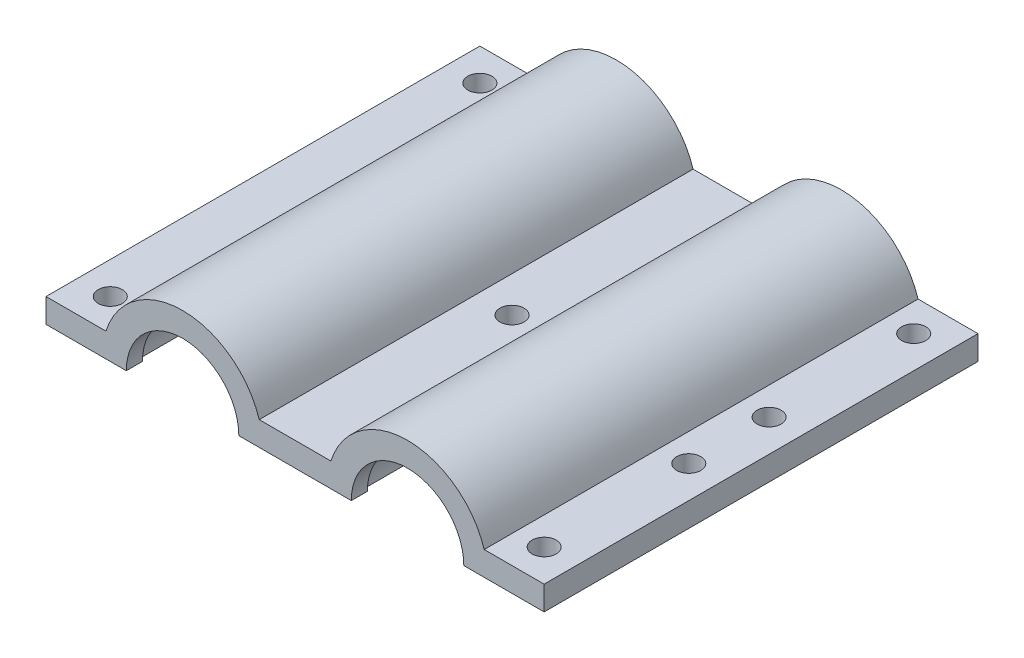
ISO-10303-21;
HEADER;
FILE_DESCRIPTION(('STEP AP214'),'2;1');
FILE_NAME('part.step','',(''),(''),'','','');
FILE_SCHEMA(('AUTOMOTIVE_DESIGN { 1 0 10303 214 1 1 1 1 }'));
ENDSEC;
DATA;
#1=APPLICATION_CONTEXT('core data for automotive mechanical design processes');
#2=APPLICATION_PROTOCOL_DEFINITION('international standard','automotive_design',2000,#1);
#3=PRODUCT_CONTEXT('',#1,'mechanical');
#4=PRODUCT('Part','Part','',(#3));
#5=PRODUCT_RELATED_PRODUCT_CATEGORY('part','',(#4));
#6=PRODUCT_DEFINITION_FORMATION('','',#4);
#7=PRODUCT_DEFINITION_CONTEXT('part definition',#1,'design');
#8=PRODUCT_DEFINITION('design','',#6,#7);
#9=PRODUCT_DEFINITION_SHAPE('','',#8);
#10=(LENGTH_UNIT() NAMED_UNIT(*) SI_UNIT(.MILLI.,.METRE.));
#11=(NAMED_UNIT(*) PLANE_ANGLE_UNIT() SI_UNIT($,.RADIAN.));
#12=(NAMED_UNIT(*) SI_UNIT($,.STERADIAN.) SOLID_ANGLE_UNIT());
#13=UNCERTAINTY_MEASURE_WITH_UNIT(LENGTH_MEASURE(1.E-05),#10,'distance_accuracy_value','');
#14=(GEOMETRIC_REPRESENTATION_CONTEXT(3) GLOBAL_UNCERTAINTY_ASSIGNED_CONTEXT((#13)) GLOBAL_UNIT_ASSIGNED_CONTEXT((#10,
#11,#12)) REPRESENTATION_CONTEXT('',''));
#15=CARTESIAN_POINT('',(0.,0.,0.));
#16=DIRECTION('',(0.,0.,1.));
#17=DIRECTION('',(1.,0.,0.));
#18=AXIS2_PLACEMENT_3D('',#15,#16,#17);
#19=CARTESIAN_POINT('',(14.,0.,27.));
#20=DIRECTION('',(0.,0.,-1.));
#21=DIRECTION('',(-1.,0.,0.));
#22=AXIS2_PLACEMENT_3D('',#19,#20,#21);
#23=CYLINDRICAL_SURFACE('',#22,7.5);
#24=CARTESIAN_POINT('',(14.,0.,-1.));
#25=DIRECTION('',(0.,0.,1.));
#26=DIRECTION('',(1.,0.,0.));
#27=AXIS2_PLACEMENT_3D('',#24,#25,#26);
#28=CIRCLE('',#27,7.5);
#29=CARTESIAN_POINT('',(6.5,0.,-1.));
#30=VERTEX_POINT('',#29);
#31=CARTESIAN_POINT('',(21.5,0.,-1.));
#32=VERTEX_POINT('',#31);
#33=EDGE_CURVE('E56',#30,#32,#28,.F.);
#34=ORIENTED_EDGE('',*,*,#33,.F.);
#35=DIRECTION('',(0.,0.,-1.));
#36=VECTOR('',#35,1.);
#37=CARTESIAN_POINT('',(6.5,0.,27.));
#38=LINE('',#37,#36);
#39=CARTESIAN_POINT('',(6.5,0.,-25.));
#40=VERTEX_POINT('',#39);
#41=EDGE_CURVE('E434',#30,#40,#38,.T.);
#42=ORIENTED_EDGE('',*,*,#41,.T.);
#43=CARTESIAN_POINT('',(14.,0.,-25.));
#44=DIRECTION('',(0.,0.,-1.));
#45=DIRECTION('',(-1.,0.,0.));
#46=AXIS2_PLACEMENT_3D('',#43,#44,#45);
#47=CIRCLE('',#46,7.5);
#48=CARTESIAN_POINT('',(21.5,0.,-25.));
#49=VERTEX_POINT('',#48);
#50=EDGE_CURVE('E304',#49,#40,#47,.F.);
#51=ORIENTED_EDGE('',*,*,#50,.F.);
#52=DIRECTION('',(0.,0.,-1.));
#53=VECTOR('',#52,1.);
#54=CARTESIAN_POINT('',(21.5,0.,27.));
#55=LINE('',#54,#53);
#56=EDGE_CURVE('E430',#32,#49,#55,.T.);
#57=ORIENTED_EDGE('',*,*,#56,.F.);
#58=EDGE_LOOP('',(#34,#42,#51,#57));
#59=FACE_BOUND('',#58,.T.);
#60=ADVANCED_FACE('F41',(#59),#23,.F.);
#61=CARTESIAN_POINT('',(-14.,0.,27.));
#62=DIRECTION('',(0.,0.,-1.));
#63=DIRECTION('',(-1.,0.,0.));
#64=AXIS2_PLACEMENT_3D('',#61,#62,#63);
#65=CYLINDRICAL_SURFACE('',#64,7.5);
#66=CARTESIAN_POINT('',(-14.,0.,-1.));
#67=DIRECTION('',(0.,0.,1.));
#68=DIRECTION('',(1.,0.,0.));
#69=AXIS2_PLACEMENT_3D('',#66,#67,#68);
#70=CIRCLE('',#69,7.5);
#71=CARTESIAN_POINT('',(-21.5,0.,-1.));
#72=VERTEX_POINT('',#71);
#73=CARTESIAN_POINT('',(-6.5,0.,-1.));
#74=VERTEX_POINT('',#73);
#75=EDGE_CURVE('E285',#72,#74,#70,.F.);
#76=ORIENTED_EDGE('',*,*,#75,.F.);
#77=DIRECTION('',(0.,0.,-1.));
#78=VECTOR('',#77,1.);
#79=CARTESIAN_POINT('',(-21.5,0.,27.));
#80=LINE('',#79,#78);
#81=CARTESIAN_POINT('',(-21.5,0.,-25.));
#82=VERTEX_POINT('',#81);
#83=EDGE_CURVE('E439',#72,#82,#80,.T.);
#84=ORIENTED_EDGE('',*,*,#83,.T.);
#85=CARTESIAN_POINT('',(-14.,0.,-25.));
#86=DIRECTION('',(0.,0.,-1.));
#87=DIRECTION('',(-1.,0.,0.));
#88=AXIS2_PLACEMENT_3D('',#85,#86,#87);
#89=CIRCLE('',#88,7.5);
#90=CARTESIAN_POINT('',(-6.5,0.,-25.));
#91=VERTEX_POINT('',#90);
#92=EDGE_CURVE('E324',#91,#82,#89,.F.);
#93=ORIENTED_EDGE('',*,*,#92,.F.);
#94=DIRECTION('',(0.,0.,-1.));
#95=VECTOR('',#94,1.);
#96=CARTESIAN_POINT('',(-6.5,0.,27.));
#97=LINE('',#96,#95);
#98=EDGE_CURVE('E436',#74,#91,#97,.T.);
#99=ORIENTED_EDGE('',*,*,#98,.F.);
#100=EDGE_LOOP('',(#76,#84,#93,#99));
#101=FACE_BOUND('',#100,.T.);
#102=ADVANCED_FACE('F447',(#101),#65,.F.);
#103=CARTESIAN_POINT('',(6.5,0.,25.));
#104=VERTEX_POINT('',#103);
#105=CARTESIAN_POINT('',(6.5,0.,1.));
#106=VERTEX_POINT('',#105);
#107=EDGE_CURVE('E64',#104,#106,#38,.T.);
#108=ORIENTED_EDGE('',*,*,#107,.T.);
#109=CARTESIAN_POINT('',(14.,0.,1.));
#110=DIRECTION('',(0.,0.,1.));
#111=DIRECTION('',(1.,0.,0.));
#112=AXIS2_PLACEMENT_3D('',#109,#110,#111);
#113=CIRCLE('',#112,7.5);
#114=CARTESIAN_POINT('',(21.5,0.,1.));
#115=VERTEX_POINT('',#114);
#116=EDGE_CURVE('E233',#106,#115,#113,.F.);
#117=ORIENTED_EDGE('',*,*,#116,.T.);
#118=CARTESIAN_POINT('',(21.5,0.,25.));
#119=VERTEX_POINT('',#118);
#120=EDGE_CURVE('E431',#119,#115,#55,.T.);
#121=ORIENTED_EDGE('',*,*,#120,.F.);
#122=CARTESIAN_POINT('',(14.,0.,25.));
#123=DIRECTION('',(0.,0.,1.));
#124=DIRECTION('',(1.,0.,0.));
#125=AXIS2_PLACEMENT_3D('',#122,#123,#124);
#126=CIRCLE('',#125,7.5);
#127=EDGE_CURVE('E344',#104,#119,#126,.F.);
#128=ORIENTED_EDGE('',*,*,#127,.F.);
#129=EDGE_LOOP('',(#108,#117,#121,#128));
#130=FACE_BOUND('',#129,.T.);
#131=ADVANCED_FACE('F483',(#130),#23,.F.);
#132=CARTESIAN_POINT('',(-21.5,0.,25.));
#133=VERTEX_POINT('',#132);
#134=CARTESIAN_POINT('',(-21.5,0.,1.));
#135=VERTEX_POINT('',#134);
#136=EDGE_CURVE('E49',#133,#135,#80,.T.);
#137=ORIENTED_EDGE('',*,*,#136,.T.);
#138=CARTESIAN_POINT('',(-14.,0.,1.));
#139=DIRECTION('',(0.,0.,1.));
#140=DIRECTION('',(1.,0.,0.));
#141=AXIS2_PLACEMENT_3D('',#138,#139,#140);
#142=CIRCLE('',#141,7.5);
#143=CARTESIAN_POINT('',(-6.5,0.,1.));
#144=VERTEX_POINT('',#143);
#145=EDGE_CURVE('E288',#135,#144,#142,.F.);
#146=ORIENTED_EDGE('',*,*,#145,.T.);
#147=CARTESIAN_POINT('',(-6.5,0.,25.));
#148=VERTEX_POINT('',#147);
#149=EDGE_CURVE('E437',#148,#144,#97,.T.);
#150=ORIENTED_EDGE('',*,*,#149,.F.);
#151=CARTESIAN_POINT('',(-14.,0.,25.));
#152=DIRECTION('',(0.,0.,1.));
#153=DIRECTION('',(1.,0.,0.));
#154=AXIS2_PLACEMENT_3D('',#151,#152,#153);
#155=CIRCLE('',#154,7.5);
#156=EDGE_CURVE('E363',#133,#148,#155,.F.);
#157=ORIENTED_EDGE('',*,*,#156,.F.);
#158=EDGE_LOOP('',(#137,#146,#150,#157));
#159=FACE_BOUND('',#158,.T.);
#160=ADVANCED_FACE('F481',(#159),#65,.F.);
#161=CARTESIAN_POINT('',(-31.,0.,27.));
#162=DIRECTION('',(1.,0.,0.));
#163=DIRECTION('',(0.,0.,-1.));
#164=AXIS2_PLACEMENT_3D('',#161,#162,#163);
#165=PLANE('',#164);
#166=DIRECTION('',(0.,-1.,0.));
#167=VECTOR('',#166,1.);
#168=CARTESIAN_POINT('',(-31.,0.,-27.));
#169=LINE('',#168,#167);
#170=CARTESIAN_POINT('',(-31.,3.,-27.));
#171=VERTEX_POINT('',#170);
#172=CARTESIAN_POINT('',(-31.,0.,-27.));
#173=VERTEX_POINT('',#172);
#174=EDGE_CURVE('E367',#171,#173,#169,.T.);
#175=ORIENTED_EDGE('',*,*,#174,.T.);
#176=DIRECTION('',(0.,0.,-1.));
#177=VECTOR('',#176,1.);
#178=CARTESIAN_POINT('',(-31.,0.,27.));
#179=LINE('',#178,#177);
#180=CARTESIAN_POINT('',(-31.,0.,27.));
#181=VERTEX_POINT('',#180);
#182=EDGE_CURVE('E11',#181,#173,#179,.T.);
#183=ORIENTED_EDGE('',*,*,#182,.F.);
#184=DIRECTION('',(0.,-1.,0.));
#185=VECTOR('',#184,1.);
#186=CARTESIAN_POINT('',(-31.,0.,27.));
#187=LINE('',#186,#185);
#188=CARTESIAN_POINT('',(-31.,3.,27.));
#189=VERTEX_POINT('',#188);
#190=EDGE_CURVE('E368',#189,#181,#187,.T.);
#191=ORIENTED_EDGE('',*,*,#190,.F.);
#192=DIRECTION('',(0.,0.,-1.));
#193=VECTOR('',#192,1.);
#194=CARTESIAN_POINT('',(-31.,3.,27.));
#195=LINE('',#194,#193);
#196=EDGE_CURVE('E390',#189,#171,#195,.T.);
#197=ORIENTED_EDGE('',*,*,#196,.T.);
#198=EDGE_LOOP('',(#175,#183,#191,#197));
#199=FACE_BOUND('',#198,.T.);
#200=ADVANCED_FACE('F43',(#199),#165,.F.);
#201=CARTESIAN_POINT('',(-31.,0.,27.));
#202=DIRECTION('',(0.,1.,0.));
#203=DIRECTION('',(0.,0.,1.));
#204=AXIS2_PLACEMENT_3D('',#201,#202,#203);
#205=PLANE('',#204);
#206=CARTESIAN_POINT('',(-27.,0.,23.));
#207=DIRECTION('',(0.,1.,0.));
#208=DIRECTION('',(0.,0.,1.));
#209=AXIS2_PLACEMENT_3D('',#206,#207,#208);
#210=CIRCLE('',#209,1.5);
#211=CARTESIAN_POINT('',(-27.,0.,24.5));
#212=VERTEX_POINT('',#211);
#213=EDGE_CURVE('E526',#212,#212,#210,.T.);
#214=ORIENTED_EDGE('',*,*,#213,.T.);
#215=EDGE_LOOP('',(#214));
#216=FACE_BOUND('',#215,.T.);
#217=CARTESIAN_POINT('',(-27.,0.,-23.));
#218=DIRECTION('',(0.,1.,0.));
#219=DIRECTION('',(0.,0.,1.));
#220=AXIS2_PLACEMENT_3D('',#217,#218,#219);
#221=CIRCLE('',#220,1.5);
#222=CARTESIAN_POINT('',(-27.,0.,-21.5));
#223=VERTEX_POINT('',#222);
#224=EDGE_CURVE('E256',#223,#223,#221,.T.);
#225=ORIENTED_EDGE('',*,*,#224,.T.);
#226=EDGE_LOOP('',(#225));
#227=FACE_BOUND('',#226,.T.);
#228=ORIENTED_EDGE('',*,*,#83,.F.);
#229=DIRECTION('',(1.,0.,0.));
#230=VECTOR('',#229,1.);
#231=CARTESIAN_POINT('',(-22.,0.,-1.));
#232=LINE('',#231,#230);
#233=CARTESIAN_POINT('',(-21.,0.,-1.));
#234=VERTEX_POINT('',#233);
#235=EDGE_CURVE('E268',#72,#234,#232,.T.);
#236=ORIENTED_EDGE('',*,*,#235,.T.);
#237=DIRECTION('',(0.,0.,-1.));
#238=VECTOR('',#237,1.);
#239=CARTESIAN_POINT('',(-21.,0.,1.));
#240=LINE('',#239,#238);
#241=CARTESIAN_POINT('',(-21.,0.,1.));
#242=VERTEX_POINT('',#241);
#243=EDGE_CURVE('E273',#242,#234,#240,.T.);
#244=ORIENTED_EDGE('',*,*,#243,.F.);
#245=DIRECTION('',(1.,0.,0.));
#246=VECTOR('',#245,1.);
#247=CARTESIAN_POINT('',(-22.,0.,1.));
#248=LINE('',#247,#246);
#249=EDGE_CURVE('E271',#135,#242,#248,.T.);
#250=ORIENTED_EDGE('',*,*,#249,.F.);
#251=ORIENTED_EDGE('',*,*,#136,.F.);
#252=DIRECTION('',(1.,0.,0.));
#253=VECTOR('',#252,1.);
#254=CARTESIAN_POINT('',(-22.,0.,25.));
#255=LINE('',#254,#253);
#256=CARTESIAN_POINT('',(-21.,0.,25.));
#257=VERTEX_POINT('',#256);
#258=EDGE_CURVE('E355',#133,#257,#255,.T.);
#259=ORIENTED_EDGE('',*,*,#258,.T.);
#260=DIRECTION('',(0.,0.,1.));
#261=VECTOR('',#260,1.);
#262=CARTESIAN_POINT('',(-21.,0.,25.));
#263=LINE('',#262,#261);
#264=CARTESIAN_POINT('',(-21.,0.,27.));
#265=VERTEX_POINT('',#264);
#266=EDGE_CURVE('E360',#257,#265,#263,.T.);
#267=ORIENTED_EDGE('',*,*,#266,.T.);
#268=DIRECTION('',(1.,0.,0.));
#269=VECTOR('',#268,1.);
#270=CARTESIAN_POINT('',(-31.,0.,27.));
#271=LINE('',#270,#269);
#272=EDGE_CURVE('E371',#181,#265,#271,.T.);
#273=ORIENTED_EDGE('',*,*,#272,.F.);
#274=ORIENTED_EDGE('',*,*,#182,.T.);
#275=DIRECTION('',(1.,0.,0.));
#276=VECTOR('',#275,1.);
#277=CARTESIAN_POINT('',(-31.,0.,-27.));
#278=LINE('',#277,#276);
#279=CARTESIAN_POINT('',(-21.,0.,-27.));
#280=VERTEX_POINT('',#279);
#281=EDGE_CURVE('E393',#173,#280,#278,.T.);
#282=ORIENTED_EDGE('',*,*,#281,.T.);
#283=DIRECTION('',(0.,0.,-1.));
#284=VECTOR('',#283,1.);
#285=CARTESIAN_POINT('',(-21.,0.,-25.));
#286=LINE('',#285,#284);
#287=CARTESIAN_POINT('',(-21.,0.,-25.));
#288=VERTEX_POINT('',#287);
#289=EDGE_CURVE('E318',#288,#280,#286,.T.);
#290=ORIENTED_EDGE('',*,*,#289,.F.);
#291=DIRECTION('',(1.,0.,0.));
#292=VECTOR('',#291,1.);
#293=CARTESIAN_POINT('',(-22.,0.,-25.));
#294=LINE('',#293,#292);
#295=EDGE_CURVE('E313',#82,#288,#294,.T.);
#296=ORIENTED_EDGE('',*,*,#295,.F.);
#297=EDGE_LOOP('',(#228,#236,#244,#250,#251,#259,#267,#273,#274,#282,#290,#296));
#298=FACE_BOUND('',#297,.T.);
#299=ADVANCED_FACE('F454',(#216,#227,#298),#205,.F.);
#300=CARTESIAN_POINT('',(-6.5,0.,27.));
#301=DIRECTION('',(0.,1.,0.));
#302=DIRECTION('',(0.,0.,1.));
#303=AXIS2_PLACEMENT_3D('',#300,#301,#302);
#304=PLANE('',#303);
#305=CARTESIAN_POINT('',(0.,0.,0.));
#306=DIRECTION('',(0.,1.,0.));
#307=DIRECTION('',(0.,0.,1.));
#308=AXIS2_PLACEMENT_3D('',#305,#306,#307);
#309=CIRCLE('',#308,1.5);
#310=CARTESIAN_POINT('',(0.,0.,1.5));
#311=VERTEX_POINT('',#310);
#312=EDGE_CURVE('E510',#311,#311,#309,.T.);
#313=ORIENTED_EDGE('',*,*,#312,.T.);
#314=EDGE_LOOP('',(#313));
#315=FACE_BOUND('',#314,.T.);
#316=ORIENTED_EDGE('',*,*,#41,.F.);
#317=DIRECTION('',(1.,0.,0.));
#318=VECTOR('',#317,1.);
#319=CARTESIAN_POINT('',(6.,0.,-1.));
#320=LINE('',#319,#318);
#321=CARTESIAN_POINT('',(7.,0.,-1.));
#322=VERTEX_POINT('',#321);
#323=EDGE_CURVE('E241',#30,#322,#320,.T.);
#324=ORIENTED_EDGE('',*,*,#323,.T.);
#325=DIRECTION('',(0.,0.,-1.));
#326=VECTOR('',#325,1.);
#327=CARTESIAN_POINT('',(7.,0.,1.));
#328=LINE('',#327,#326);
#329=CARTESIAN_POINT('',(7.,0.,1.));
#330=VERTEX_POINT('',#329);
#331=EDGE_CURVE('E238',#330,#322,#328,.T.);
#332=ORIENTED_EDGE('',*,*,#331,.F.);
#333=DIRECTION('',(1.,0.,0.));
#334=VECTOR('',#333,1.);
#335=CARTESIAN_POINT('',(6.,0.,1.));
#336=LINE('',#335,#334);
#337=EDGE_CURVE('E226',#106,#330,#336,.T.);
#338=ORIENTED_EDGE('',*,*,#337,.F.);
#339=ORIENTED_EDGE('',*,*,#107,.F.);
#340=DIRECTION('',(1.,0.,0.));
#341=VECTOR('',#340,1.);
#342=CARTESIAN_POINT('',(6.,0.,25.));
#343=LINE('',#342,#341);
#344=CARTESIAN_POINT('',(7.,0.,25.));
#345=VERTEX_POINT('',#344);
#346=EDGE_CURVE('E330',#104,#345,#343,.T.);
#347=ORIENTED_EDGE('',*,*,#346,.T.);
#348=DIRECTION('',(0.,0.,1.));
#349=VECTOR('',#348,1.);
#350=CARTESIAN_POINT('',(7.,0.,25.));
#351=LINE('',#350,#349);
#352=CARTESIAN_POINT('',(7.,0.,27.));
#353=VERTEX_POINT('',#352);
#354=EDGE_CURVE('E338',#345,#353,#351,.T.);
#355=ORIENTED_EDGE('',*,*,#354,.T.);
#356=DIRECTION('',(1.,0.,0.));
#357=VECTOR('',#356,1.);
#358=CARTESIAN_POINT('',(-6.5,0.,27.));
#359=LINE('',#358,#357);
#360=CARTESIAN_POINT('',(-7.,0.,27.));
#361=VERTEX_POINT('',#360);
#362=EDGE_CURVE('E374',#361,#353,#359,.T.);
#363=ORIENTED_EDGE('',*,*,#362,.F.);
#364=DIRECTION('',(0.,0.,1.));
#365=VECTOR('',#364,1.);
#366=CARTESIAN_POINT('',(-7.,0.,25.));
#367=LINE('',#366,#365);
#368=CARTESIAN_POINT('',(-7.,0.,25.));
#369=VERTEX_POINT('',#368);
#370=EDGE_CURVE('E357',#369,#361,#367,.T.);
#371=ORIENTED_EDGE('',*,*,#370,.F.);
#372=DIRECTION('',(1.,0.,0.));
#373=VECTOR('',#372,1.);
#374=CARTESIAN_POINT('',(-7.,0.,25.));
#375=LINE('',#374,#373);
#376=EDGE_CURVE('E352',#369,#148,#375,.T.);
#377=ORIENTED_EDGE('',*,*,#376,.T.);
#378=ORIENTED_EDGE('',*,*,#149,.T.);
#379=DIRECTION('',(1.,0.,0.));
#380=VECTOR('',#379,1.);
#381=CARTESIAN_POINT('',(-7.,0.,1.));
#382=LINE('',#381,#380);
#383=CARTESIAN_POINT('',(-7.,0.,1.));
#384=VERTEX_POINT('',#383);
#385=EDGE_CURVE('E267',#384,#144,#382,.T.);
#386=ORIENTED_EDGE('',*,*,#385,.F.);
#387=DIRECTION('',(0.,0.,-1.));
#388=VECTOR('',#387,1.);
#389=CARTESIAN_POINT('',(-7.,0.,1.));
#390=LINE('',#389,#388);
#391=CARTESIAN_POINT('',(-7.,0.,-1.));
#392=VERTEX_POINT('',#391);
#393=EDGE_CURVE('E282',#384,#392,#390,.T.);
#394=ORIENTED_EDGE('',*,*,#393,.T.);
#395=DIRECTION('',(1.,0.,0.));
#396=VECTOR('',#395,1.);
#397=CARTESIAN_POINT('',(-7.,0.,-1.));
#398=LINE('',#397,#396);
#399=EDGE_CURVE('E276',#392,#74,#398,.T.);
#400=ORIENTED_EDGE('',*,*,#399,.T.);
#401=ORIENTED_EDGE('',*,*,#98,.T.);
#402=DIRECTION('',(1.,0.,0.));
#403=VECTOR('',#402,1.);
#404=CARTESIAN_POINT('',(-7.,0.,-25.));
#405=LINE('',#404,#403);
#406=CARTESIAN_POINT('',(-7.,0.,-25.));
#407=VERTEX_POINT('',#406);
#408=EDGE_CURVE('E315',#407,#91,#405,.T.);
#409=ORIENTED_EDGE('',*,*,#408,.F.);
#410=DIRECTION('',(0.,0.,-1.));
#411=VECTOR('',#410,1.);
#412=CARTESIAN_POINT('',(-7.,0.,-25.));
#413=LINE('',#412,#411);
#414=CARTESIAN_POINT('',(-7.,0.,-27.));
#415=VERTEX_POINT('',#414);
#416=EDGE_CURVE('E321',#407,#415,#413,.T.);
#417=ORIENTED_EDGE('',*,*,#416,.T.);
#418=DIRECTION('',(1.,0.,0.));
#419=VECTOR('',#418,1.);
#420=CARTESIAN_POINT('',(-6.5,0.,-27.));
#421=LINE('',#420,#419);
#422=CARTESIAN_POINT('',(7.,0.,-27.));
#423=VERTEX_POINT('',#422);
#424=EDGE_CURVE('E395',#415,#423,#421,.T.);
#425=ORIENTED_EDGE('',*,*,#424,.T.);
#426=DIRECTION('',(0.,0.,-1.));
#427=VECTOR('',#426,1.);
#428=CARTESIAN_POINT('',(7.,0.,-25.));
#429=LINE('',#428,#427);
#430=CARTESIAN_POINT('',(7.,0.,-25.));
#431=VERTEX_POINT('',#430);
#432=EDGE_CURVE('E301',#431,#423,#429,.T.);
#433=ORIENTED_EDGE('',*,*,#432,.F.);
#434=DIRECTION('',(1.,0.,0.));
#435=VECTOR('',#434,1.);
#436=CARTESIAN_POINT('',(6.,0.,-25.));
#437=LINE('',#436,#435);
#438=EDGE_CURVE('E296',#40,#431,#437,.T.);
#439=ORIENTED_EDGE('',*,*,#438,.F.);
#440=EDGE_LOOP('',(#316,#324,#332,#338,#339,#347,#355,#363,#371,#377,#378,#386,#394,#400,#401,
#409,#417,#425,#433,#439));
#441=FACE_BOUND('',#440,.T.);
#442=ADVANCED_FACE('F239',(#315,#441),#304,.F.);
#443=CARTESIAN_POINT('',(21.5,0.,27.));
#444=DIRECTION('',(0.,1.,0.));
#445=DIRECTION('',(0.,0.,1.));
#446=AXIS2_PLACEMENT_3D('',#443,#444,#445);
#447=PLANE('',#446);
#448=CARTESIAN_POINT('',(27.,0.,5.));
#449=DIRECTION('',(0.,1.,0.));
#450=DIRECTION('',(0.,0.,1.));
#451=AXIS2_PLACEMENT_3D('',#448,#449,#450);
#452=CIRCLE('',#451,1.5);
#453=CARTESIAN_POINT('',(27.,0.,6.5));
#454=VERTEX_POINT('',#453);
#455=EDGE_CURVE('E945',#454,#454,#452,.T.);
#456=ORIENTED_EDGE('',*,*,#455,.T.);
#457=EDGE_LOOP('',(#456));
#458=FACE_BOUND('',#457,.T.);
#459=CARTESIAN_POINT('',(27.,0.,-5.));
#460=DIRECTION('',(0.,1.,0.));
#461=DIRECTION('',(0.,0.,1.));
#462=AXIS2_PLACEMENT_3D('',#459,#460,#461);
#463=CIRCLE('',#462,1.5);
#464=CARTESIAN_POINT('',(27.,0.,-3.5));
#465=VERTEX_POINT('',#464);
#466=EDGE_CURVE('E519',#465,#465,#463,.T.);
#467=ORIENTED_EDGE('',*,*,#466,.T.);
#468=EDGE_LOOP('',(#467));
#469=FACE_BOUND('',#468,.T.);
#470=CARTESIAN_POINT('',(27.,0.,23.));
#471=DIRECTION('',(0.,1.,0.));
#472=DIRECTION('',(0.,0.,1.));
#473=AXIS2_PLACEMENT_3D('',#470,#471,#472);
#474=CIRCLE('',#473,1.5);
#475=CARTESIAN_POINT('',(27.,0.,24.5));
#476=VERTEX_POINT('',#475);
#477=EDGE_CURVE('E534',#476,#476,#474,.T.);
#478=ORIENTED_EDGE('',*,*,#477,.T.);
#479=EDGE_LOOP('',(#478));
#480=FACE_BOUND('',#479,.T.);
#481=CARTESIAN_POINT('',(27.,0.,-23.));
#482=DIRECTION('',(0.,1.,0.));
#483=DIRECTION('',(0.,0.,1.));
#484=AXIS2_PLACEMENT_3D('',#481,#482,#483);
#485=CIRCLE('',#484,1.5);
#486=CARTESIAN_POINT('',(27.,0.,-21.5));
#487=VERTEX_POINT('',#486);
#488=EDGE_CURVE('E516',#487,#487,#485,.T.);
#489=ORIENTED_EDGE('',*,*,#488,.T.);
#490=EDGE_LOOP('',(#489));
#491=FACE_BOUND('',#490,.T.);
#492=ORIENTED_EDGE('',*,*,#120,.T.);
#493=DIRECTION('',(1.,0.,0.));
#494=VECTOR('',#493,1.);
#495=CARTESIAN_POINT('',(21.,0.,1.));
#496=LINE('',#495,#494);
#497=CARTESIAN_POINT('',(21.,0.,1.));
#498=VERTEX_POINT('',#497);
#499=EDGE_CURVE('E249',#498,#115,#496,.T.);
#500=ORIENTED_EDGE('',*,*,#499,.F.);
#501=DIRECTION('',(0.,0.,-1.));
#502=VECTOR('',#501,1.);
#503=CARTESIAN_POINT('',(21.,0.,1.));
#504=LINE('',#503,#502);
#505=CARTESIAN_POINT('',(21.,0.,-1.));
#506=VERTEX_POINT('',#505);
#507=EDGE_CURVE('E244',#498,#506,#504,.T.);
#508=ORIENTED_EDGE('',*,*,#507,.T.);
#509=DIRECTION('',(1.,0.,0.));
#510=VECTOR('',#509,1.);
#511=CARTESIAN_POINT('',(21.,0.,-1.));
#512=LINE('',#511,#510);
#513=EDGE_CURVE('E235',#506,#32,#512,.T.);
#514=ORIENTED_EDGE('',*,*,#513,.T.);
#515=ORIENTED_EDGE('',*,*,#56,.T.);
#516=DIRECTION('',(1.,0.,0.));
#517=VECTOR('',#516,1.);
#518=CARTESIAN_POINT('',(21.,0.,-25.));
#519=LINE('',#518,#517);
#520=CARTESIAN_POINT('',(21.,0.,-25.));
#521=VERTEX_POINT('',#520);
#522=EDGE_CURVE('E291',#521,#49,#519,.T.);
#523=ORIENTED_EDGE('',*,*,#522,.F.);
#524=DIRECTION('',(0.,0.,-1.));
#525=VECTOR('',#524,1.);
#526=CARTESIAN_POINT('',(21.,0.,-25.));
#527=LINE('',#526,#525);
#528=CARTESIAN_POINT('',(21.,0.,-27.));
#529=VERTEX_POINT('',#528);
#530=EDGE_CURVE('E298',#521,#529,#527,.T.);
#531=ORIENTED_EDGE('',*,*,#530,.T.);
#532=DIRECTION('',(1.,0.,0.));
#533=VECTOR('',#532,1.);
#534=CARTESIAN_POINT('',(21.5,0.,-27.));
#535=LINE('',#534,#533);
#536=CARTESIAN_POINT('',(31.,0.,-27.));
#537=VERTEX_POINT('',#536);
#538=EDGE_CURVE('E397',#529,#537,#535,.T.);
#539=ORIENTED_EDGE('',*,*,#538,.T.);
#540=DIRECTION('',(0.,0.,-1.));
#541=VECTOR('',#540,1.);
#542=CARTESIAN_POINT('',(31.,0.,27.));
#543=LINE('',#542,#541);
#544=CARTESIAN_POINT('',(31.,0.,27.));
#545=VERTEX_POINT('',#544);
#546=EDGE_CURVE('E427',#545,#537,#543,.T.);
#547=ORIENTED_EDGE('',*,*,#546,.F.);
#548=DIRECTION('',(1.,0.,0.));
#549=VECTOR('',#548,1.);
#550=CARTESIAN_POINT('',(21.5,0.,27.));
#551=LINE('',#550,#549);
#552=CARTESIAN_POINT('',(21.,0.,27.));
#553=VERTEX_POINT('',#552);
#554=EDGE_CURVE('E376',#553,#545,#551,.T.);
#555=ORIENTED_EDGE('',*,*,#554,.F.);
#556=DIRECTION('',(0.,0.,1.));
#557=VECTOR('',#556,1.);
#558=CARTESIAN_POINT('',(21.,0.,25.));
#559=LINE('',#558,#557);
#560=CARTESIAN_POINT('',(21.,0.,25.));
#561=VERTEX_POINT('',#560);
#562=EDGE_CURVE('E341',#561,#553,#559,.T.);
#563=ORIENTED_EDGE('',*,*,#562,.F.);
#564=DIRECTION('',(1.,0.,0.));
#565=VECTOR('',#564,1.);
#566=CARTESIAN_POINT('',(21.,0.,25.));
#567=LINE('',#566,#565);
#568=EDGE_CURVE('E335',#561,#119,#567,.T.);
#569=ORIENTED_EDGE('',*,*,#568,.T.);
#570=EDGE_LOOP('',(#492,#500,#508,#514,#515,#523,#531,#539,#547,#555,#563,#569));
#571=FACE_BOUND('',#570,.T.);
#572=ADVANCED_FACE('F497',(#458,#469,#480,#491,#571),#447,.F.);
#573=CARTESIAN_POINT('',(31.,0.,27.));
#574=DIRECTION('',(-1.,0.,0.));
#575=DIRECTION('',(0.,0.,1.));
#576=AXIS2_PLACEMENT_3D('',#573,#574,#575);
#577=PLANE('',#576);
#578=DIRECTION('',(0.,1.,0.));
#579=VECTOR('',#578,1.);
#580=CARTESIAN_POINT('',(31.,0.,-27.));
#581=LINE('',#580,#579);
#582=CARTESIAN_POINT('',(31.,3.,-27.));
#583=VERTEX_POINT('',#582);
#584=EDGE_CURVE('E399',#537,#583,#581,.T.);
#585=ORIENTED_EDGE('',*,*,#584,.T.);
#586=DIRECTION('',(0.,0.,-1.));
#587=VECTOR('',#586,1.);
#588=CARTESIAN_POINT('',(31.,3.,27.));
#589=LINE('',#588,#587);
#590=CARTESIAN_POINT('',(31.,3.,27.));
#591=VERTEX_POINT('',#590);
#592=EDGE_CURVE('E424',#591,#583,#589,.T.);
#593=ORIENTED_EDGE('',*,*,#592,.F.);
#594=DIRECTION('',(0.,1.,0.));
#595=VECTOR('',#594,1.);
#596=CARTESIAN_POINT('',(31.,0.,27.));
#597=LINE('',#596,#595);
#598=EDGE_CURVE('E378',#545,#591,#597,.T.);
#599=ORIENTED_EDGE('',*,*,#598,.F.);
#600=ORIENTED_EDGE('',*,*,#546,.T.);
#601=EDGE_LOOP('',(#585,#593,#599,#600));
#602=FACE_BOUND('',#601,.T.);
#603=ADVANCED_FACE('F505',(#602),#577,.F.);
#604=CARTESIAN_POINT('',(23.5393920141695,3.,27.));
#605=DIRECTION('',(0.,-1.,0.));
#606=DIRECTION('',(0.,0.,-1.));
#607=AXIS2_PLACEMENT_3D('',#604,#605,#606);
#608=PLANE('',#607);
#609=CARTESIAN_POINT('',(27.,3.,5.));
#610=DIRECTION('',(0.,1.,0.));
#611=DIRECTION('',(0.,0.,1.));
#612=AXIS2_PLACEMENT_3D('',#609,#610,#611);
#613=CIRCLE('',#612,1.5);
#614=CARTESIAN_POINT('',(27.,3.,6.5));
#615=VERTEX_POINT('',#614);
#616=EDGE_CURVE('E942',#615,#615,#613,.T.);
#617=ORIENTED_EDGE('',*,*,#616,.F.);
#618=EDGE_LOOP('',(#617));
#619=FACE_BOUND('',#618,.T.);
#620=CARTESIAN_POINT('',(27.,3.,-5.));
#621=DIRECTION('',(0.,1.,0.));
#622=DIRECTION('',(0.,0.,1.));
#623=AXIS2_PLACEMENT_3D('',#620,#621,#622);
#624=CIRCLE('',#623,1.5);
#625=CARTESIAN_POINT('',(27.,3.,-3.5));
#626=VERTEX_POINT('',#625);
#627=EDGE_CURVE('E946',#626,#626,#624,.T.);
#628=ORIENTED_EDGE('',*,*,#627,.F.);
#629=EDGE_LOOP('',(#628));
#630=FACE_BOUND('',#629,.T.);
#631=CARTESIAN_POINT('',(27.,3.,23.));
#632=DIRECTION('',(0.,1.,0.));
#633=DIRECTION('',(0.,0.,1.));
#634=AXIS2_PLACEMENT_3D('',#631,#632,#633);
#635=CIRCLE('',#634,1.5);
#636=CARTESIAN_POINT('',(27.,3.,24.5));
#637=VERTEX_POINT('',#636);
#638=EDGE_CURVE('E541',#637,#637,#635,.T.);
#639=ORIENTED_EDGE('',*,*,#638,.F.);
#640=EDGE_LOOP('',(#639));
#641=FACE_BOUND('',#640,.T.);
#642=CARTESIAN_POINT('',(27.,3.,-23.));
#643=DIRECTION('',(0.,1.,0.));
#644=DIRECTION('',(0.,0.,1.));
#645=AXIS2_PLACEMENT_3D('',#642,#643,#644);
#646=CIRCLE('',#645,1.5);
#647=CARTESIAN_POINT('',(27.,3.,-21.5));
#648=VERTEX_POINT('',#647);
#649=EDGE_CURVE('E512',#648,#648,#646,.T.);
#650=ORIENTED_EDGE('',*,*,#649,.F.);
#651=EDGE_LOOP('',(#650));
#652=FACE_BOUND('',#651,.T.);
#653=DIRECTION('',(-1.,0.,0.));
#654=VECTOR('',#653,1.);
#655=CARTESIAN_POINT('',(23.5393920141695,3.,-27.));
#656=LINE('',#655,#654);
#657=CARTESIAN_POINT('',(23.5393920141695,3.,-27.));
#658=VERTEX_POINT('',#657);
#659=EDGE_CURVE('E401',#583,#658,#656,.T.);
#660=ORIENTED_EDGE('',*,*,#659,.T.);
#661=DIRECTION('',(0.,0.,-1.));
#662=VECTOR('',#661,1.);
#663=CARTESIAN_POINT('',(23.5393920141695,3.,27.));
#664=LINE('',#663,#662);
#665=CARTESIAN_POINT('',(23.5393920141695,3.,27.));
#666=VERTEX_POINT('',#665);
#667=EDGE_CURVE('E421',#666,#658,#664,.T.);
#668=ORIENTED_EDGE('',*,*,#667,.F.);
#669=DIRECTION('',(-1.,0.,0.));
#670=VECTOR('',#669,1.);
#671=CARTESIAN_POINT('',(23.5393920141695,3.,27.));
#672=LINE('',#671,#670);
#673=EDGE_CURVE('E380',#591,#666,#672,.T.);
#674=ORIENTED_EDGE('',*,*,#673,.F.);
#675=ORIENTED_EDGE('',*,*,#592,.T.);
#676=EDGE_LOOP('',(#660,#668,#674,#675));
#677=FACE_BOUND('',#676,.T.);
#678=ADVANCED_FACE('F556',(#619,#630,#641,#652,#677),#608,.F.);
#679=CARTESIAN_POINT('',(14.,0.,27.));
#680=DIRECTION('',(0.,0.,-1.));
#681=DIRECTION('',(-1.,0.,0.));
#682=AXIS2_PLACEMENT_3D('',#679,#680,#681);
#683=CYLINDRICAL_SURFACE('',#682,10.);
#684=CARTESIAN_POINT('',(14.,0.,-27.));
#685=DIRECTION('',(0.,0.,1.));
#686=DIRECTION('',(1.,0.,0.));
#687=AXIS2_PLACEMENT_3D('',#684,#685,#686);
#688=CIRCLE('',#687,10.);
#689=CARTESIAN_POINT('',(4.46060798583054,3.,-27.));
#690=VERTEX_POINT('',#689);
#691=EDGE_CURVE('E403',#658,#690,#688,.T.);
#692=ORIENTED_EDGE('',*,*,#691,.T.);
#693=DIRECTION('',(0.,0.,-1.));
#694=VECTOR('',#693,1.);
#695=CARTESIAN_POINT('',(4.46060798583054,3.,27.));
#696=LINE('',#695,#694);
#697=CARTESIAN_POINT('',(4.46060798583054,3.,27.));
#698=VERTEX_POINT('',#697);
#699=EDGE_CURVE('E418',#698,#690,#696,.T.);
#700=ORIENTED_EDGE('',*,*,#699,.F.);
#701=CARTESIAN_POINT('',(14.,0.,27.));
#702=DIRECTION('',(0.,0.,1.));
#703=DIRECTION('',(1.,0.,0.));
#704=AXIS2_PLACEMENT_3D('',#701,#702,#703);
#705=CIRCLE('',#704,10.);
#706=EDGE_CURVE('E382',#666,#698,#705,.T.);
#707=ORIENTED_EDGE('',*,*,#706,.F.);
#708=ORIENTED_EDGE('',*,*,#667,.T.);
#709=EDGE_LOOP('',(#692,#700,#707,#708));
#710=FACE_BOUND('',#709,.T.);
#711=ADVANCED_FACE('F559',(#710),#683,.T.);
#712=CARTESIAN_POINT('',(-4.46060798583054,3.,27.));
#713=DIRECTION('',(0.,-1.,0.));
#714=DIRECTION('',(0.,0.,-1.));
#715=AXIS2_PLACEMENT_3D('',#712,#713,#714);
#716=PLANE('',#715);
#717=CARTESIAN_POINT('',(0.,3.,0.));
#718=DIRECTION('',(0.,1.,0.));
#719=DIRECTION('',(0.,0.,1.));
#720=AXIS2_PLACEMENT_3D('',#717,#718,#719);
#721=CIRCLE('',#720,1.5);
#722=CARTESIAN_POINT('',(0.,3.,1.5));
#723=VERTEX_POINT('',#722);
#724=EDGE_CURVE('E513',#723,#723,#721,.T.);
#725=ORIENTED_EDGE('',*,*,#724,.F.);
#726=EDGE_LOOP('',(#725));
#727=FACE_BOUND('',#726,.T.);
#728=DIRECTION('',(-1.,0.,0.));
#729=VECTOR('',#728,1.);
#730=CARTESIAN_POINT('',(-4.46060798583054,3.,-27.));
#731=LINE('',#730,#729);
#732=CARTESIAN_POINT('',(-4.46060798583054,3.,-27.));
#733=VERTEX_POINT('',#732);
#734=EDGE_CURVE('E405',#690,#733,#731,.T.);
#735=ORIENTED_EDGE('',*,*,#734,.T.);
#736=DIRECTION('',(0.,0.,-1.));
#737=VECTOR('',#736,1.);
#738=CARTESIAN_POINT('',(-4.46060798583054,3.,27.));
#739=LINE('',#738,#737);
#740=CARTESIAN_POINT('',(-4.46060798583054,3.,27.));
#741=VERTEX_POINT('',#740);
#742=EDGE_CURVE('E415',#741,#733,#739,.T.);
#743=ORIENTED_EDGE('',*,*,#742,.F.);
#744=DIRECTION('',(-1.,0.,0.));
#745=VECTOR('',#744,1.);
#746=CARTESIAN_POINT('',(-4.46060798583054,3.,27.));
#747=LINE('',#746,#745);
#748=EDGE_CURVE('E384',#698,#741,#747,.T.);
#749=ORIENTED_EDGE('',*,*,#748,.F.);
#750=ORIENTED_EDGE('',*,*,#699,.T.);
#751=EDGE_LOOP('',(#735,#743,#749,#750));
#752=FACE_BOUND('',#751,.T.);
#753=ADVANCED_FACE('F579',(#727,#752),#716,.F.);
#754=CARTESIAN_POINT('',(-14.,0.,27.));
#755=DIRECTION('',(0.,0.,-1.));
#756=DIRECTION('',(-1.,0.,0.));
#757=AXIS2_PLACEMENT_3D('',#754,#755,#756);
#758=CYLINDRICAL_SURFACE('',#757,10.);
#759=CARTESIAN_POINT('',(-14.,0.,-27.));
#760=DIRECTION('',(0.,0.,1.));
#761=DIRECTION('',(1.,0.,0.));
#762=AXIS2_PLACEMENT_3D('',#759,#760,#761);
#763=CIRCLE('',#762,10.);
#764=CARTESIAN_POINT('',(-23.5393920141695,3.,-27.));
#765=VERTEX_POINT('',#764);
#766=EDGE_CURVE('E407',#733,#765,#763,.T.);
#767=ORIENTED_EDGE('',*,*,#766,.T.);
#768=DIRECTION('',(0.,0.,-1.));
#769=VECTOR('',#768,1.);
#770=CARTESIAN_POINT('',(-23.5393920141695,3.,27.));
#771=LINE('',#770,#769);
#772=CARTESIAN_POINT('',(-23.5393920141695,3.,27.));
#773=VERTEX_POINT('',#772);
#774=EDGE_CURVE('E412',#773,#765,#771,.T.);
#775=ORIENTED_EDGE('',*,*,#774,.F.);
#776=CARTESIAN_POINT('',(-14.,0.,27.));
#777=DIRECTION('',(0.,0.,1.));
#778=DIRECTION('',(1.,0.,0.));
#779=AXIS2_PLACEMENT_3D('',#776,#777,#778);
#780=CIRCLE('',#779,10.);
#781=EDGE_CURVE('E386',#741,#773,#780,.T.);
#782=ORIENTED_EDGE('',*,*,#781,.F.);
#783=ORIENTED_EDGE('',*,*,#742,.T.);
#784=EDGE_LOOP('',(#767,#775,#782,#783));
#785=FACE_BOUND('',#784,.T.);
#786=ADVANCED_FACE('F583',(#785),#758,.T.);
#787=CARTESIAN_POINT('',(-31.,3.,27.));
#788=DIRECTION('',(0.,-1.,0.));
#789=DIRECTION('',(0.,0.,-1.));
#790=AXIS2_PLACEMENT_3D('',#787,#788,#789);
#791=PLANE('',#790);
#792=CARTESIAN_POINT('',(-27.,3.,23.));
#793=DIRECTION('',(0.,1.,0.));
#794=DIRECTION('',(0.,0.,1.));
#795=AXIS2_PLACEMENT_3D('',#792,#793,#794);
#796=CIRCLE('',#795,1.5);
#797=CARTESIAN_POINT('',(-27.,3.,24.5));
#798=VERTEX_POINT('',#797);
#799=EDGE_CURVE('E530',#798,#798,#796,.T.);
#800=ORIENTED_EDGE('',*,*,#799,.F.);
#801=EDGE_LOOP('',(#800));
#802=FACE_BOUND('',#801,.T.);
#803=CARTESIAN_POINT('',(-27.,3.,-23.));
#804=DIRECTION('',(0.,1.,0.));
#805=DIRECTION('',(0.,0.,1.));
#806=AXIS2_PLACEMENT_3D('',#803,#804,#805);
#807=CIRCLE('',#806,1.5);
#808=CARTESIAN_POINT('',(-27.,3.,-21.5));
#809=VERTEX_POINT('',#808);
#810=EDGE_CURVE('E524',#809,#809,#807,.T.);
#811=ORIENTED_EDGE('',*,*,#810,.F.);
#812=EDGE_LOOP('',(#811));
#813=FACE_BOUND('',#812,.T.);
#814=DIRECTION('',(-1.,0.,0.));
#815=VECTOR('',#814,1.);
#816=CARTESIAN_POINT('',(-31.,3.,-27.));
#817=LINE('',#816,#815);
#818=EDGE_CURVE('E372',#765,#171,#817,.T.);
#819=ORIENTED_EDGE('',*,*,#818,.T.);
#820=ORIENTED_EDGE('',*,*,#196,.F.);
#821=DIRECTION('',(-1.,0.,0.));
#822=VECTOR('',#821,1.);
#823=CARTESIAN_POINT('',(-31.,3.,27.));
#824=LINE('',#823,#822);
#825=EDGE_CURVE('E388',#773,#189,#824,.T.);
#826=ORIENTED_EDGE('',*,*,#825,.F.);
#827=ORIENTED_EDGE('',*,*,#774,.T.);
#828=EDGE_LOOP('',(#819,#820,#826,#827));
#829=FACE_BOUND('',#828,.T.);
#830=ADVANCED_FACE('F628',(#802,#813,#829),#791,.F.);
#831=CARTESIAN_POINT('',(-14.,0.,27.));
#832=DIRECTION('',(0.,0.,1.));
#833=DIRECTION('',(1.,0.,0.));
#834=AXIS2_PLACEMENT_3D('',#831,#832,#833);
#835=PLANE('',#834);
#836=ORIENTED_EDGE('',*,*,#362,.T.);
#837=CARTESIAN_POINT('',(14.,0.,27.));
#838=DIRECTION('',(0.,0.,-1.));
#839=DIRECTION('',(1.,0.,0.));
#840=AXIS2_PLACEMENT_3D('',#837,#838,#839);
#841=CIRCLE('',#840,7.);
#842=EDGE_CURVE('E329',#353,#553,#841,.T.);
#843=ORIENTED_EDGE('',*,*,#842,.T.);
#844=ORIENTED_EDGE('',*,*,#554,.T.);
#845=ORIENTED_EDGE('',*,*,#598,.T.);
#846=ORIENTED_EDGE('',*,*,#673,.T.);
#847=ORIENTED_EDGE('',*,*,#706,.T.);
#848=ORIENTED_EDGE('',*,*,#748,.T.);
#849=ORIENTED_EDGE('',*,*,#781,.T.);
#850=ORIENTED_EDGE('',*,*,#825,.T.);
#851=ORIENTED_EDGE('',*,*,#190,.T.);
#852=ORIENTED_EDGE('',*,*,#272,.T.);
#853=CARTESIAN_POINT('',(-14.,0.,27.));
#854=DIRECTION('',(0.,0.,-1.));
#855=DIRECTION('',(1.,0.,0.));
#856=AXIS2_PLACEMENT_3D('',#853,#854,#855);
#857=CIRCLE('',#856,7.);
#858=EDGE_CURVE('E348',#265,#361,#857,.T.);
#859=ORIENTED_EDGE('',*,*,#858,.T.);
#860=EDGE_LOOP('',(#836,#843,#844,#845,#846,#847,#848,#849,#850,#851,#852,#859));
#861=FACE_BOUND('',#860,.T.);
#862=ADVANCED_FACE('F587',(#861),#835,.T.);
#863=CARTESIAN_POINT('',(-14.,0.,-27.));
#864=DIRECTION('',(0.,0.,1.));
#865=DIRECTION('',(1.,0.,0.));
#866=AXIS2_PLACEMENT_3D('',#863,#864,#865);
#867=PLANE('',#866);
#868=CARTESIAN_POINT('',(14.,0.,-27.));
#869=DIRECTION('',(0.,0.,-1.));
#870=DIRECTION('',(1.,0.,0.));
#871=AXIS2_PLACEMENT_3D('',#868,#869,#870);
#872=CIRCLE('',#871,7.);
#873=EDGE_CURVE('E290',#423,#529,#872,.T.);
#874=ORIENTED_EDGE('',*,*,#873,.F.);
#875=ORIENTED_EDGE('',*,*,#424,.F.);
#876=CARTESIAN_POINT('',(-14.,0.,-27.));
#877=DIRECTION('',(0.,0.,-1.));
#878=DIRECTION('',(1.,0.,0.));
#879=AXIS2_PLACEMENT_3D('',#876,#877,#878);
#880=CIRCLE('',#879,7.);
#881=EDGE_CURVE('E309',#280,#415,#880,.T.);
#882=ORIENTED_EDGE('',*,*,#881,.F.);
#883=ORIENTED_EDGE('',*,*,#281,.F.);
#884=ORIENTED_EDGE('',*,*,#174,.F.);
#885=ORIENTED_EDGE('',*,*,#818,.F.);
#886=ORIENTED_EDGE('',*,*,#766,.F.);
#887=ORIENTED_EDGE('',*,*,#734,.F.);
#888=ORIENTED_EDGE('',*,*,#691,.F.);
#889=ORIENTED_EDGE('',*,*,#659,.F.);
#890=ORIENTED_EDGE('',*,*,#584,.F.);
#891=ORIENTED_EDGE('',*,*,#538,.F.);
#892=EDGE_LOOP('',(#874,#875,#882,#883,#884,#885,#886,#887,#888,#889,#890,#891));
#893=FACE_BOUND('',#892,.T.);
#894=ADVANCED_FACE('F574',(#893),#867,.F.);
#895=CARTESIAN_POINT('',(-14.,0.,25.));
#896=DIRECTION('',(0.,0.,1.));
#897=DIRECTION('',(1.,0.,0.));
#898=AXIS2_PLACEMENT_3D('',#895,#896,#897);
#899=PLANE('',#898);
#900=ORIENTED_EDGE('',*,*,#258,.F.);
#901=ORIENTED_EDGE('',*,*,#156,.T.);
#902=ORIENTED_EDGE('',*,*,#376,.F.);
#903=CARTESIAN_POINT('',(-14.,0.,25.));
#904=DIRECTION('',(0.,0.,-1.));
#905=DIRECTION('',(1.,0.,0.));
#906=AXIS2_PLACEMENT_3D('',#903,#904,#905);
#907=CIRCLE('',#906,7.);
#908=EDGE_CURVE('E349',#257,#369,#907,.T.);
#909=ORIENTED_EDGE('',*,*,#908,.F.);
#910=EDGE_LOOP('',(#900,#901,#902,#909));
#911=FACE_BOUND('',#910,.T.);
#912=ADVANCED_FACE('F479',(#911),#899,.F.);
#913=CARTESIAN_POINT('',(-14.,0.,25.));
#914=DIRECTION('',(0.,0.,1.));
#915=DIRECTION('',(1.,0.,0.));
#916=AXIS2_PLACEMENT_3D('',#913,#914,#915);
#917=CYLINDRICAL_SURFACE('',#916,7.);
#918=ORIENTED_EDGE('',*,*,#858,.F.);
#919=ORIENTED_EDGE('',*,*,#266,.F.);
#920=ORIENTED_EDGE('',*,*,#908,.T.);
#921=ORIENTED_EDGE('',*,*,#370,.T.);
#922=EDGE_LOOP('',(#918,#919,#920,#921));
#923=FACE_BOUND('',#922,.T.);
#924=ADVANCED_FACE('F477',(#923),#917,.F.);
#925=CARTESIAN_POINT('',(14.,0.,25.));
#926=DIRECTION('',(0.,0.,1.));
#927=DIRECTION('',(1.,0.,0.));
#928=AXIS2_PLACEMENT_3D('',#925,#926,#927);
#929=PLANE('',#928);
#930=ORIENTED_EDGE('',*,*,#346,.F.);
#931=ORIENTED_EDGE('',*,*,#127,.T.);
#932=ORIENTED_EDGE('',*,*,#568,.F.);
#933=CARTESIAN_POINT('',(14.,0.,25.));
#934=DIRECTION('',(0.,0.,-1.));
#935=DIRECTION('',(1.,0.,0.));
#936=AXIS2_PLACEMENT_3D('',#933,#934,#935);
#937=CIRCLE('',#936,7.);
#938=EDGE_CURVE('E332',#345,#561,#937,.T.);
#939=ORIENTED_EDGE('',*,*,#938,.F.);
#940=EDGE_LOOP('',(#930,#931,#932,#939));
#941=FACE_BOUND('',#940,.T.);
#942=ADVANCED_FACE('F612',(#941),#929,.F.);
#943=CARTESIAN_POINT('',(14.,0.,25.));
#944=DIRECTION('',(0.,0.,1.));
#945=DIRECTION('',(1.,0.,0.));
#946=AXIS2_PLACEMENT_3D('',#943,#944,#945);
#947=CYLINDRICAL_SURFACE('',#946,7.);
#948=ORIENTED_EDGE('',*,*,#842,.F.);
#949=ORIENTED_EDGE('',*,*,#354,.F.);
#950=ORIENTED_EDGE('',*,*,#938,.T.);
#951=ORIENTED_EDGE('',*,*,#562,.T.);
#952=EDGE_LOOP('',(#948,#949,#950,#951));
#953=FACE_BOUND('',#952,.T.);
#954=ADVANCED_FACE('F611',(#953),#947,.F.);
#955=CARTESIAN_POINT('',(-14.,0.,-25.));
#956=DIRECTION('',(0.,0.,-1.));
#957=DIRECTION('',(1.,0.,0.));
#958=AXIS2_PLACEMENT_3D('',#955,#956,#957);
#959=PLANE('',#958);
#960=ORIENTED_EDGE('',*,*,#408,.T.);
#961=ORIENTED_EDGE('',*,*,#92,.T.);
#962=ORIENTED_EDGE('',*,*,#295,.T.);
#963=CARTESIAN_POINT('',(-14.,0.,-25.));
#964=DIRECTION('',(0.,0.,-1.));
#965=DIRECTION('',(1.,0.,0.));
#966=AXIS2_PLACEMENT_3D('',#963,#964,#965);
#967=CIRCLE('',#966,7.);
#968=EDGE_CURVE('E310',#288,#407,#967,.T.);
#969=ORIENTED_EDGE('',*,*,#968,.T.);
#970=EDGE_LOOP('',(#960,#961,#962,#969));
#971=FACE_BOUND('',#970,.T.);
#972=ADVANCED_FACE('F452',(#971),#959,.F.);
#973=CARTESIAN_POINT('',(-14.,0.,-25.));
#974=DIRECTION('',(0.,0.,-1.));
#975=DIRECTION('',(-1.,0.,0.));
#976=AXIS2_PLACEMENT_3D('',#973,#974,#975);
#977=CYLINDRICAL_SURFACE('',#976,7.);
#978=ORIENTED_EDGE('',*,*,#881,.T.);
#979=ORIENTED_EDGE('',*,*,#416,.F.);
#980=ORIENTED_EDGE('',*,*,#968,.F.);
#981=ORIENTED_EDGE('',*,*,#289,.T.);
#982=EDGE_LOOP('',(#978,#979,#980,#981));
#983=FACE_BOUND('',#982,.T.);
#984=ADVANCED_FACE('F459',(#983),#977,.F.);
#985=CARTESIAN_POINT('',(14.,0.,-25.));
#986=DIRECTION('',(0.,0.,-1.));
#987=DIRECTION('',(1.,0.,0.));
#988=AXIS2_PLACEMENT_3D('',#985,#986,#987);
#989=PLANE('',#988);
#990=ORIENTED_EDGE('',*,*,#522,.T.);
#991=ORIENTED_EDGE('',*,*,#50,.T.);
#992=ORIENTED_EDGE('',*,*,#438,.T.);
#993=CARTESIAN_POINT('',(14.,0.,-25.));
#994=DIRECTION('',(0.,0.,-1.));
#995=DIRECTION('',(1.,0.,0.));
#996=AXIS2_PLACEMENT_3D('',#993,#994,#995);
#997=CIRCLE('',#996,7.);
#998=EDGE_CURVE('E294',#431,#521,#997,.T.);
#999=ORIENTED_EDGE('',*,*,#998,.T.);
#1000=EDGE_LOOP('',(#990,#991,#992,#999));
#1001=FACE_BOUND('',#1000,.T.);
#1002=ADVANCED_FACE('F599',(#1001),#989,.F.);
#1003=CARTESIAN_POINT('',(14.,0.,-25.));
#1004=DIRECTION('',(0.,0.,-1.));
#1005=DIRECTION('',(-1.,0.,0.));
#1006=AXIS2_PLACEMENT_3D('',#1003,#1004,#1005);
#1007=CYLINDRICAL_SURFACE('',#1006,7.);
#1008=ORIENTED_EDGE('',*,*,#873,.T.);
#1009=ORIENTED_EDGE('',*,*,#530,.F.);
#1010=ORIENTED_EDGE('',*,*,#998,.F.);
#1011=ORIENTED_EDGE('',*,*,#432,.T.);
#1012=EDGE_LOOP('',(#1008,#1009,#1010,#1011));
#1013=FACE_BOUND('',#1012,.T.);
#1014=ADVANCED_FACE('F594',(#1013),#1007,.F.);
#1015=CARTESIAN_POINT('',(-14.,0.,1.));
#1016=DIRECTION('',(0.,0.,1.));
#1017=DIRECTION('',(1.,0.,0.));
#1018=AXIS2_PLACEMENT_3D('',#1015,#1016,#1017);
#1019=PLANE('',#1018);
#1020=ORIENTED_EDGE('',*,*,#145,.F.);
#1021=ORIENTED_EDGE('',*,*,#249,.T.);
#1022=CARTESIAN_POINT('',(-14.,0.,1.));
#1023=DIRECTION('',(0.,0.,-1.));
#1024=DIRECTION('',(1.,0.,0.));
#1025=AXIS2_PLACEMENT_3D('',#1022,#1023,#1024);
#1026=CIRCLE('',#1025,7.);
#1027=EDGE_CURVE('E264',#242,#384,#1026,.T.);
#1028=ORIENTED_EDGE('',*,*,#1027,.T.);
#1029=ORIENTED_EDGE('',*,*,#385,.T.);
#1030=EDGE_LOOP('',(#1020,#1021,#1028,#1029));
#1031=FACE_BOUND('',#1030,.T.);
#1032=ADVANCED_FACE('F471',(#1031),#1019,.T.);
#1033=CARTESIAN_POINT('',(-14.,0.,-1.));
#1034=DIRECTION('',(0.,0.,1.));
#1035=DIRECTION('',(1.,0.,0.));
#1036=AXIS2_PLACEMENT_3D('',#1033,#1034,#1035);
#1037=PLANE('',#1036);
#1038=ORIENTED_EDGE('',*,*,#235,.F.);
#1039=ORIENTED_EDGE('',*,*,#75,.T.);
#1040=ORIENTED_EDGE('',*,*,#399,.F.);
#1041=CARTESIAN_POINT('',(-14.,0.,-1.));
#1042=DIRECTION('',(0.,0.,-1.));
#1043=DIRECTION('',(1.,0.,0.));
#1044=AXIS2_PLACEMENT_3D('',#1041,#1042,#1043);
#1045=CIRCLE('',#1044,7.);
#1046=EDGE_CURVE('E263',#234,#392,#1045,.T.);
#1047=ORIENTED_EDGE('',*,*,#1046,.F.);
#1048=EDGE_LOOP('',(#1038,#1039,#1040,#1047));
#1049=FACE_BOUND('',#1048,.T.);
#1050=ADVANCED_FACE('F462',(#1049),#1037,.F.);
#1051=CARTESIAN_POINT('',(-14.,0.,1.));
#1052=DIRECTION('',(0.,0.,-1.));
#1053=DIRECTION('',(-1.,0.,0.));
#1054=AXIS2_PLACEMENT_3D('',#1051,#1052,#1053);
#1055=CYLINDRICAL_SURFACE('',#1054,7.);
#1056=ORIENTED_EDGE('',*,*,#1046,.T.);
#1057=ORIENTED_EDGE('',*,*,#393,.F.);
#1058=ORIENTED_EDGE('',*,*,#1027,.F.);
#1059=ORIENTED_EDGE('',*,*,#243,.T.);
#1060=EDGE_LOOP('',(#1056,#1057,#1058,#1059));
#1061=FACE_BOUND('',#1060,.T.);
#1062=ADVANCED_FACE('F468',(#1061),#1055,.F.);
#1063=CARTESIAN_POINT('',(14.,0.,1.));
#1064=DIRECTION('',(0.,0.,1.));
#1065=DIRECTION('',(1.,0.,0.));
#1066=AXIS2_PLACEMENT_3D('',#1063,#1064,#1065);
#1067=PLANE('',#1066);
#1068=ORIENTED_EDGE('',*,*,#116,.F.);
#1069=ORIENTED_EDGE('',*,*,#337,.T.);
#1070=CARTESIAN_POINT('',(14.,0.,1.));
#1071=DIRECTION('',(0.,0.,-1.));
#1072=DIRECTION('',(1.,0.,0.));
#1073=AXIS2_PLACEMENT_3D('',#1070,#1071,#1072);
#1074=CIRCLE('',#1073,7.);
#1075=EDGE_CURVE('E231',#330,#498,#1074,.T.);
#1076=ORIENTED_EDGE('',*,*,#1075,.T.);
#1077=ORIENTED_EDGE('',*,*,#499,.T.);
#1078=EDGE_LOOP('',(#1068,#1069,#1076,#1077));
#1079=FACE_BOUND('',#1078,.T.);
#1080=ADVANCED_FACE('F228',(#1079),#1067,.T.);
#1081=CARTESIAN_POINT('',(14.,0.,-1.));
#1082=DIRECTION('',(0.,0.,1.));
#1083=DIRECTION('',(1.,0.,0.));
#1084=AXIS2_PLACEMENT_3D('',#1081,#1082,#1083);
#1085=PLANE('',#1084);
#1086=ORIENTED_EDGE('',*,*,#323,.F.);
#1087=ORIENTED_EDGE('',*,*,#33,.T.);
#1088=ORIENTED_EDGE('',*,*,#513,.F.);
#1089=CARTESIAN_POINT('',(14.,0.,-1.));
#1090=DIRECTION('',(0.,0.,-1.));
#1091=DIRECTION('',(1.,0.,0.));
#1092=AXIS2_PLACEMENT_3D('',#1089,#1090,#1091);
#1093=CIRCLE('',#1092,7.);
#1094=EDGE_CURVE('E255',#322,#506,#1093,.T.);
#1095=ORIENTED_EDGE('',*,*,#1094,.F.);
#1096=EDGE_LOOP('',(#1086,#1087,#1088,#1095));
#1097=FACE_BOUND('',#1096,.T.);
#1098=ADVANCED_FACE('F602',(#1097),#1085,.F.);
#1099=CARTESIAN_POINT('',(14.,0.,1.));
#1100=DIRECTION('',(0.,0.,-1.));
#1101=DIRECTION('',(-1.,0.,0.));
#1102=AXIS2_PLACEMENT_3D('',#1099,#1100,#1101);
#1103=CYLINDRICAL_SURFACE('',#1102,7.);
#1104=ORIENTED_EDGE('',*,*,#1094,.T.);
#1105=ORIENTED_EDGE('',*,*,#507,.F.);
#1106=ORIENTED_EDGE('',*,*,#1075,.F.);
#1107=ORIENTED_EDGE('',*,*,#331,.T.);
#1108=EDGE_LOOP('',(#1104,#1105,#1106,#1107));
#1109=FACE_BOUND('',#1108,.T.);
#1110=ADVANCED_FACE('F246',(#1109),#1103,.F.);
#1111=CARTESIAN_POINT('',(-27.,0.,-23.));
#1112=DIRECTION('',(0.,1.,0.));
#1113=DIRECTION('',(0.,0.,1.));
#1114=AXIS2_PLACEMENT_3D('',#1111,#1112,#1113);
#1115=CYLINDRICAL_SURFACE('',#1114,1.5);
#1116=ORIENTED_EDGE('',*,*,#224,.F.);
#1117=EDGE_LOOP('',(#1116));
#1118=FACE_BOUND('',#1117,.T.);
#1119=ORIENTED_EDGE('',*,*,#810,.T.);
#1120=EDGE_LOOP('',(#1119));
#1121=FACE_BOUND('',#1120,.T.);
#1122=ADVANCED_FACE('F755',(#1118,#1121),#1115,.F.);
#1123=CARTESIAN_POINT('',(-27.,0.,23.));
#1124=DIRECTION('',(0.,1.,0.));
#1125=DIRECTION('',(0.,0.,1.));
#1126=AXIS2_PLACEMENT_3D('',#1123,#1124,#1125);
#1127=CYLINDRICAL_SURFACE('',#1126,1.5);
#1128=ORIENTED_EDGE('',*,*,#213,.F.);
#1129=EDGE_LOOP('',(#1128));
#1130=FACE_BOUND('',#1129,.T.);
#1131=ORIENTED_EDGE('',*,*,#799,.T.);
#1132=EDGE_LOOP('',(#1131));
#1133=FACE_BOUND('',#1132,.T.);
#1134=ADVANCED_FACE('F762',(#1130,#1133),#1127,.F.);
#1135=CARTESIAN_POINT('',(0.,0.,0.));
#1136=DIRECTION('',(0.,1.,0.));
#1137=DIRECTION('',(0.,0.,1.));
#1138=AXIS2_PLACEMENT_3D('',#1135,#1136,#1137);
#1139=CYLINDRICAL_SURFACE('',#1138,1.5);
#1140=ORIENTED_EDGE('',*,*,#312,.F.);
#1141=EDGE_LOOP('',(#1140));
#1142=FACE_BOUND('',#1141,.T.);
#1143=ORIENTED_EDGE('',*,*,#724,.T.);
#1144=EDGE_LOOP('',(#1143));
#1145=FACE_BOUND('',#1144,.T.);
#1146=ADVANCED_FACE('F552',(#1142,#1145),#1139,.F.);
#1147=CARTESIAN_POINT('',(27.,0.,-23.));
#1148=DIRECTION('',(0.,1.,0.));
#1149=DIRECTION('',(0.,0.,1.));
#1150=AXIS2_PLACEMENT_3D('',#1147,#1148,#1149);
#1151=CYLINDRICAL_SURFACE('',#1150,1.5);
#1152=ORIENTED_EDGE('',*,*,#488,.F.);
#1153=EDGE_LOOP('',(#1152));
#1154=FACE_BOUND('',#1153,.T.);
#1155=ORIENTED_EDGE('',*,*,#649,.T.);
#1156=EDGE_LOOP('',(#1155));
#1157=FACE_BOUND('',#1156,.T.);
#1158=ADVANCED_FACE('F548',(#1154,#1157),#1151,.F.);
#1159=CARTESIAN_POINT('',(27.,0.,23.));
#1160=DIRECTION('',(0.,1.,0.));
#1161=DIRECTION('',(0.,0.,1.));
#1162=AXIS2_PLACEMENT_3D('',#1159,#1160,#1161);
#1163=CYLINDRICAL_SURFACE('',#1162,1.5);
#1164=ORIENTED_EDGE('',*,*,#477,.F.);
#1165=EDGE_LOOP('',(#1164));
#1166=FACE_BOUND('',#1165,.T.);
#1167=ORIENTED_EDGE('',*,*,#638,.T.);
#1168=EDGE_LOOP('',(#1167));
#1169=FACE_BOUND('',#1168,.T.);
#1170=ADVANCED_FACE('F551',(#1166,#1169),#1163,.F.);
#1171=CARTESIAN_POINT('',(27.,-7.,-5.));
#1172=DIRECTION('',(0.,1.,0.));
#1173=DIRECTION('',(0.,0.,1.));
#1174=AXIS2_PLACEMENT_3D('',#1171,#1172,#1173);
#1175=CYLINDRICAL_SURFACE('',#1174,1.5);
#1176=ORIENTED_EDGE('',*,*,#627,.T.);
#1177=EDGE_LOOP('',(#1176));
#1178=FACE_BOUND('',#1177,.T.);
#1179=ORIENTED_EDGE('',*,*,#466,.F.);
#1180=EDGE_LOOP('',(#1179));
#1181=FACE_BOUND('',#1180,.T.);
#1182=ADVANCED_FACE('F787',(#1178,#1181),#1175,.F.);
#1183=CARTESIAN_POINT('',(27.,-7.,5.));
#1184=DIRECTION('',(0.,1.,0.));
#1185=DIRECTION('',(0.,0.,1.));
#1186=AXIS2_PLACEMENT_3D('',#1183,#1184,#1185);
#1187=CYLINDRICAL_SURFACE('',#1186,1.5);
#1188=ORIENTED_EDGE('',*,*,#616,.T.);
#1189=EDGE_LOOP('',(#1188));
#1190=FACE_BOUND('',#1189,.T.);
#1191=ORIENTED_EDGE('',*,*,#455,.F.);
#1192=EDGE_LOOP('',(#1191));
#1193=FACE_BOUND('',#1192,.T.);
#1194=ADVANCED_FACE('F794',(#1190,#1193),#1187,.F.);
#1195=CLOSED_SHELL('',(#60,#102,#131,#160,#200,#299,#442,#572,#603,#678,#711,#753,#786,#830,
#862,#894,#912,#924,#942,#954,#972,#984,#1002,#1014,#1032,#1050,#1062,#1080,#1098,#1110,#1122,
#1134,#1146,#1158,#1170,#1182,#1194));
#1196=MANIFOLD_SOLID_BREP('B2',#1195);
#1197=ADVANCED_BREP_SHAPE_REPRESENTATION('',(#18,#1196),#14);
#1198=SHAPE_DEFINITION_REPRESENTATION(#9,#1197);
ENDSEC;
END-ISO-10303-21;
